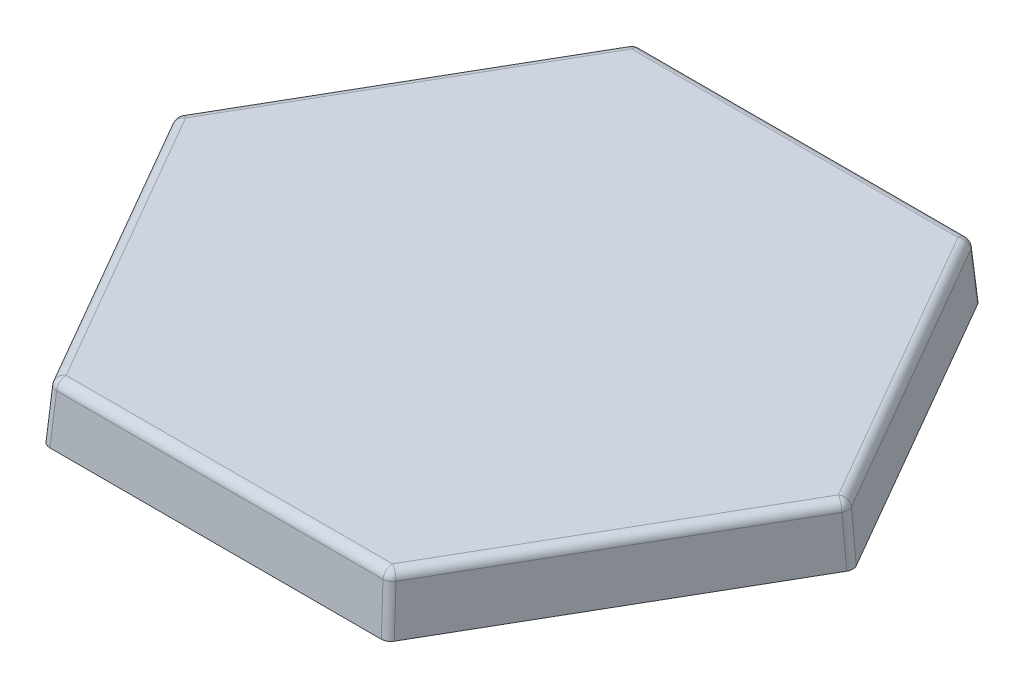
ISO-10303-21;
HEADER;
FILE_DESCRIPTION(('STEP AP214'),'2;1');
FILE_NAME('part.step','',(''),(''),'','','');
FILE_SCHEMA(('AUTOMOTIVE_DESIGN { 1 0 10303 214 1 1 1 1 }'));
ENDSEC;
DATA;
#1=APPLICATION_CONTEXT('core data for automotive mechanical design processes');
#2=APPLICATION_PROTOCOL_DEFINITION('international standard','automotive_design',2000,#1);
#3=PRODUCT_CONTEXT('',#1,'mechanical');
#4=PRODUCT('Part','Part','',(#3));
#5=PRODUCT_RELATED_PRODUCT_CATEGORY('part','',(#4));
#6=PRODUCT_DEFINITION_FORMATION('','',#4);
#7=PRODUCT_DEFINITION_CONTEXT('part definition',#1,'design');
#8=PRODUCT_DEFINITION('design','',#6,#7);
#9=PRODUCT_DEFINITION_SHAPE('','',#8);
#10=(LENGTH_UNIT() NAMED_UNIT(*) SI_UNIT(.MILLI.,.METRE.));
#11=(NAMED_UNIT(*) PLANE_ANGLE_UNIT() SI_UNIT($,.RADIAN.));
#12=(NAMED_UNIT(*) SI_UNIT($,.STERADIAN.) SOLID_ANGLE_UNIT());
#13=UNCERTAINTY_MEASURE_WITH_UNIT(LENGTH_MEASURE(1.E-05),#10,'distance_accuracy_value','');
#14=(GEOMETRIC_REPRESENTATION_CONTEXT(3) GLOBAL_UNCERTAINTY_ASSIGNED_CONTEXT((#13)) GLOBAL_UNIT_ASSIGNED_CONTEXT((#10,
#11,#12)) REPRESENTATION_CONTEXT('',''));
#15=CARTESIAN_POINT('',(0.,0.,0.));
#16=DIRECTION('',(0.,0.,1.));
#17=DIRECTION('',(1.,0.,0.));
#18=AXIS2_PLACEMENT_3D('',#15,#16,#17);
#19=CARTESIAN_POINT('',(35.9038062383901,0.,62.18721659));
#20=DIRECTION('',(0.862729915662821,0.0871557427476584,0.498097349045872));
#21=DIRECTION('',(0.5,0.,-0.866025403784439));
#22=AXIS2_PLACEMENT_3D('',#19,#20,#21);
#23=PLANE('',#22);
#24=DIRECTION('',(0.5,0.,-0.866025403784439));
#25=VECTOR('',#24,1.);
#26=CARTESIAN_POINT('',(35.4359946785055,10.1743114854953,61.2172161517632));
#27=LINE('',#26,#25);
#28=CARTESIAN_POINT('',(70.2046176256569,10.1743114854953,0.996194698091736));
#29=VERTEX_POINT('',#28);
#30=CARTESIAN_POINT('',(35.9650387284913,10.1743114854953,60.3008849777458));
#31=VERTEX_POINT('',#30);
#32=EDGE_CURVE('E365',#29,#31,#27,.F.);
#33=ORIENTED_EDGE('',*,*,#32,.T.);
#34=DIRECTION('',(-0.0502558068751963,0.994935885120892,-0.0870456108832093));
#35=VECTOR('',#34,1.);
#36=CARTESIAN_POINT('',(36.4818647827895,-0.0575168296613353,61.1960539624656));
#37=LINE('',#36,#35);
#38=CARTESIAN_POINT('',(36.4789595154986,0.,61.1910218919082));
#39=VERTEX_POINT('',#38);
#40=EDGE_CURVE('E369',#31,#39,#37,.F.);
#41=ORIENTED_EDGE('',*,*,#40,.T.);
#42=DIRECTION('',(0.5,0.,-0.866025403784439));
#43=VECTOR('',#42,1.);
#44=CARTESIAN_POINT('',(35.9038062383901,0.,62.18721659));
#45=LINE('',#44,#43);
#46=CARTESIAN_POINT('',(71.2324591996716,0.,0.996194698091743));
#47=VERTEX_POINT('',#46);
#48=EDGE_CURVE('E288',#39,#47,#45,.T.);
#49=ORIENTED_EDGE('',*,*,#48,.T.);
#50=DIRECTION('',(-0.100511613750393,0.994935885120892,0.));
#51=VECTOR('',#50,1.);
#52=CARTESIAN_POINT('',(70.8755484979047,3.53295755307842,0.996194698091736));
#53=LINE('',#52,#51);
#54=EDGE_CURVE('E367',#47,#29,#53,.T.);
#55=ORIENTED_EDGE('',*,*,#54,.T.);
#56=EDGE_LOOP('',(#33,#41,#49,#55));
#57=FACE_BOUND('',#56,.T.);
#58=ADVANCED_FACE('F33',(#57),#23,.T.);
#59=CARTESIAN_POINT('',(71.8076124767801,0.,0.));
#60=DIRECTION('',(0.862729915662821,0.0871557427476584,-0.498097349045873));
#61=DIRECTION('',(-0.5,0.,-0.866025403784439));
#62=AXIS2_PLACEMENT_3D('',#59,#60,#61);
#63=PLANE('',#62);
#64=DIRECTION('',(-0.5,0.,-0.866025403784439));
#65=VECTOR('',#64,1.);
#66=CARTESIAN_POINT('',(70.7336616756428,10.1743114854953,-0.0798635240743281));
#67=LINE('',#66,#65);
#68=CARTESIAN_POINT('',(35.9650387284913,10.1743114854953,-60.3008849777458));
#69=VERTEX_POINT('',#68);
#70=CARTESIAN_POINT('',(70.2046176256569,10.1743114854953,-0.996194698091754));
#71=VERTEX_POINT('',#70);
#72=EDGE_CURVE('E371',#69,#71,#67,.F.);
#73=ORIENTED_EDGE('',*,*,#72,.T.);
#74=DIRECTION('',(-0.100511613750393,0.994935885120892,0.));
#75=VECTOR('',#74,1.);
#76=CARTESIAN_POINT('',(71.2382697342533,-0.0575168296613346,-0.996194698091753));
#77=LINE('',#76,#75);
#78=CARTESIAN_POINT('',(71.2324591996716,0.,-0.996194698091751));
#79=VERTEX_POINT('',#78);
#80=EDGE_CURVE('E375',#71,#79,#77,.F.);
#81=ORIENTED_EDGE('',*,*,#80,.T.);
#82=DIRECTION('',(-0.5,0.,-0.866025403784439));
#83=VECTOR('',#82,1.);
#84=CARTESIAN_POINT('',(71.8076124767801,0.,0.));
#85=LINE('',#84,#83);
#86=CARTESIAN_POINT('',(36.4789595154986,0.,-61.1910218919083));
#87=VERTEX_POINT('',#86);
#88=EDGE_CURVE('E323',#79,#87,#85,.T.);
#89=ORIENTED_EDGE('',*,*,#88,.T.);
#90=DIRECTION('',(-0.0502558068751962,0.994935885120892,0.0870456108832093));
#91=VECTOR('',#90,1.);
#92=CARTESIAN_POINT('',(36.3005041646152,3.53295755307842,-60.8819281572956));
#93=LINE('',#92,#91);
#94=EDGE_CURVE('E373',#87,#69,#93,.T.);
#95=ORIENTED_EDGE('',*,*,#94,.T.);
#96=EDGE_LOOP('',(#73,#81,#89,#95));
#97=FACE_BOUND('',#96,.T.);
#98=ADVANCED_FACE('F490',(#97),#63,.T.);
#99=CARTESIAN_POINT('',(35.90380623839,0.,-62.18721659));
#100=DIRECTION('',(0.,0.0871557427476584,-0.996194698091746));
#101=DIRECTION('',(0.,0.996194698091746,0.0871557427476584));
#102=AXIS2_PLACEMENT_3D('',#99,#100,#101);
#103=PLANE('',#102);
#104=DIRECTION('',(-1.,0.,0.));
#105=VECTOR('',#104,1.);
#106=CARTESIAN_POINT('',(35.2976669971372,10.1743114854953,-61.2970796758376));
#107=LINE('',#106,#105);
#108=CARTESIAN_POINT('',(-34.2395788971657,10.1743114854953,-61.2970796758376));
#109=VERTEX_POINT('',#108);
#110=CARTESIAN_POINT('',(34.2395788971656,10.1743114854953,-61.2970796758376));
#111=VERTEX_POINT('',#110);
#112=EDGE_CURVE('E377',#109,#111,#107,.F.);
#113=ORIENTED_EDGE('',*,*,#112,.T.);
#114=DIRECTION('',(-0.0502558068751963,0.994935885120892,0.0870456108832093));
#115=VECTOR('',#114,1.);
#116=CARTESIAN_POINT('',(34.7564049514638,-0.057516829661335,-62.1922486605573));
#117=LINE('',#116,#115);
#118=CARTESIAN_POINT('',(34.753499684173,0.,-62.18721659));
#119=VERTEX_POINT('',#118);
#120=EDGE_CURVE('E381',#111,#119,#117,.F.);
#121=ORIENTED_EDGE('',*,*,#120,.T.);
#122=DIRECTION('',(-1.,0.,0.));
#123=VECTOR('',#122,1.);
#124=CARTESIAN_POINT('',(35.90380623839,0.,-62.18721659));
#125=LINE('',#124,#123);
#126=CARTESIAN_POINT('',(-34.753499684173,0.,-62.18721659));
#127=VERTEX_POINT('',#126);
#128=EDGE_CURVE('E326',#119,#127,#125,.T.);
#129=ORIENTED_EDGE('',*,*,#128,.T.);
#130=DIRECTION('',(0.0502558068751963,0.994935885120892,0.0870456108832093));
#131=VECTOR('',#130,1.);
#132=CARTESIAN_POINT('',(-34.5750443332895,3.53295755307842,-61.8781228553874));
#133=LINE('',#132,#131);
#134=EDGE_CURVE('E379',#127,#109,#133,.T.);
#135=ORIENTED_EDGE('',*,*,#134,.T.);
#136=EDGE_LOOP('',(#113,#121,#129,#135));
#137=FACE_BOUND('',#136,.T.);
#138=ADVANCED_FACE('F460',(#137),#103,.T.);
#139=CARTESIAN_POINT('',(-35.9038062383901,0.,-62.18721659));
#140=DIRECTION('',(-0.862729915662821,0.0871557427476584,-0.498097349045873));
#141=DIRECTION('',(-0.5,0.,0.866025403784439));
#142=AXIS2_PLACEMENT_3D('',#139,#140,#141);
#143=PLANE('',#142);
#144=DIRECTION('',(-0.5,0.,0.866025403784439));
#145=VECTOR('',#144,1.);
#146=CARTESIAN_POINT('',(-35.4359946785055,10.1743114854953,-61.2172161517632));
#147=LINE('',#146,#145);
#148=CARTESIAN_POINT('',(-70.2046176256569,10.1743114854953,-0.996194698091738));
#149=VERTEX_POINT('',#148);
#150=CARTESIAN_POINT('',(-35.9650387284913,10.1743114854953,-60.3008849777458));
#151=VERTEX_POINT('',#150);
#152=EDGE_CURVE('E383',#149,#151,#147,.F.);
#153=ORIENTED_EDGE('',*,*,#152,.T.);
#154=DIRECTION('',(0.0502558068751963,0.994935885120892,0.0870456108832093));
#155=VECTOR('',#154,1.);
#156=CARTESIAN_POINT('',(-36.4818647827895,-0.0575168296613353,-61.1960539624656));
#157=LINE('',#156,#155);
#158=CARTESIAN_POINT('',(-36.4789595154986,0.,-61.1910218919083));
#159=VERTEX_POINT('',#158);
#160=EDGE_CURVE('E387',#151,#159,#157,.F.);
#161=ORIENTED_EDGE('',*,*,#160,.T.);
#162=DIRECTION('',(-0.5,0.,0.866025403784439));
#163=VECTOR('',#162,1.);
#164=CARTESIAN_POINT('',(-35.9038062383901,0.,-62.18721659));
#165=LINE('',#164,#163);
#166=CARTESIAN_POINT('',(-71.2324591996716,0.,-0.996194698091743));
#167=VERTEX_POINT('',#166);
#168=EDGE_CURVE('E329',#159,#167,#165,.T.);
#169=ORIENTED_EDGE('',*,*,#168,.T.);
#170=DIRECTION('',(0.100511613750393,0.994935885120892,0.));
#171=VECTOR('',#170,1.);
#172=CARTESIAN_POINT('',(-70.8755484979047,3.53295755307842,-0.996194698091743));
#173=LINE('',#172,#171);
#174=EDGE_CURVE('E385',#167,#149,#173,.T.);
#175=ORIENTED_EDGE('',*,*,#174,.T.);
#176=EDGE_LOOP('',(#153,#161,#169,#175));
#177=FACE_BOUND('',#176,.T.);
#178=ADVANCED_FACE('F559',(#177),#143,.T.);
#179=CARTESIAN_POINT('',(-71.8076124767801,0.,0.));
#180=DIRECTION('',(-0.862729915662821,0.0871557427476584,0.498097349045873));
#181=DIRECTION('',(0.5,0.,0.866025403784439));
#182=AXIS2_PLACEMENT_3D('',#179,#180,#181);
#183=PLANE('',#182);
#184=DIRECTION('',(0.5,0.,0.866025403784439));
#185=VECTOR('',#184,1.);
#186=CARTESIAN_POINT('',(-71.8076124767801,0.,0.));
#187=LINE('',#186,#185);
#188=CARTESIAN_POINT('',(-71.2324591996716,0.,0.996194698091752));
#189=VERTEX_POINT('',#188);
#190=CARTESIAN_POINT('',(-36.4789595154986,0.,61.1910218919082));
#191=VERTEX_POINT('',#190);
#192=EDGE_CURVE('E332',#189,#191,#187,.T.);
#193=ORIENTED_EDGE('',*,*,#192,.T.);
#194=DIRECTION('',(0.0502558068751963,0.994935885120892,-0.0870456108832093));
#195=VECTOR('',#194,1.);
#196=CARTESIAN_POINT('',(-36.3005041646152,3.53295755307842,60.8819281572956));
#197=LINE('',#196,#195);
#198=CARTESIAN_POINT('',(-35.9650387284913,10.1743114854953,60.3008849777458));
#199=VERTEX_POINT('',#198);
#200=EDGE_CURVE('E363',#191,#199,#197,.T.);
#201=ORIENTED_EDGE('',*,*,#200,.T.);
#202=DIRECTION('',(0.5,0.,0.866025403784439));
#203=VECTOR('',#202,1.);
#204=CARTESIAN_POINT('',(-70.7336616756427,10.1743114854953,0.0798635240743337));
#205=LINE('',#204,#203);
#206=CARTESIAN_POINT('',(-70.2046176256569,10.1743114854953,0.996194698091755));
#207=VERTEX_POINT('',#206);
#208=EDGE_CURVE('E359',#199,#207,#205,.F.);
#209=ORIENTED_EDGE('',*,*,#208,.T.);
#210=DIRECTION('',(0.100511613750393,0.994935885120892,0.));
#211=VECTOR('',#210,1.);
#212=CARTESIAN_POINT('',(-71.2382697342533,-0.0575168296613346,0.996194698091754));
#213=LINE('',#212,#211);
#214=EDGE_CURVE('E361',#207,#189,#213,.F.);
#215=ORIENTED_EDGE('',*,*,#214,.T.);
#216=EDGE_LOOP('',(#193,#201,#209,#215));
#217=FACE_BOUND('',#216,.T.);
#218=ADVANCED_FACE('F522',(#217),#183,.T.);
#219=CARTESIAN_POINT('',(-35.9038062383901,0.,62.18721659));
#220=DIRECTION('',(0.,0.0871557427476584,0.996194698091746));
#221=DIRECTION('',(0.,-0.996194698091746,0.0871557427476584));
#222=AXIS2_PLACEMENT_3D('',#219,#220,#221);
#223=PLANE('',#222);
#224=DIRECTION('',(1.,0.,0.));
#225=VECTOR('',#224,1.);
#226=CARTESIAN_POINT('',(-35.2976669971373,10.1743114854953,61.2970796758376));
#227=LINE('',#226,#225);
#228=CARTESIAN_POINT('',(34.2395788971657,10.1743114854953,61.2970796758376));
#229=VERTEX_POINT('',#228);
#230=CARTESIAN_POINT('',(-34.2395788971657,10.1743114854953,61.2970796758376));
#231=VERTEX_POINT('',#230);
#232=EDGE_CURVE('E340',#229,#231,#227,.F.);
#233=ORIENTED_EDGE('',*,*,#232,.T.);
#234=DIRECTION('',(0.0502558068751963,0.994935885120892,-0.0870456108832093));
#235=VECTOR('',#234,1.);
#236=CARTESIAN_POINT('',(-34.7564049514638,-0.057516829661335,62.1922486605573));
#237=LINE('',#236,#235);
#238=CARTESIAN_POINT('',(-34.753499684173,0.,62.18721659));
#239=VERTEX_POINT('',#238);
#240=EDGE_CURVE('E344',#231,#239,#237,.F.);
#241=ORIENTED_EDGE('',*,*,#240,.T.);
#242=DIRECTION('',(1.,0.,0.));
#243=VECTOR('',#242,1.);
#244=CARTESIAN_POINT('',(-35.9038062383901,0.,62.18721659));
#245=LINE('',#244,#243);
#246=CARTESIAN_POINT('',(34.753499684173,0.,62.18721659));
#247=VERTEX_POINT('',#246);
#248=EDGE_CURVE('E335',#239,#247,#245,.T.);
#249=ORIENTED_EDGE('',*,*,#248,.T.);
#250=DIRECTION('',(-0.0502558068751963,0.994935885120892,-0.0870456108832093));
#251=VECTOR('',#250,1.);
#252=CARTESIAN_POINT('',(34.5750443332895,3.53295755307842,61.8781228553873));
#253=LINE('',#252,#251);
#254=EDGE_CURVE('E342',#247,#229,#253,.T.);
#255=ORIENTED_EDGE('',*,*,#254,.T.);
#256=EDGE_LOOP('',(#233,#241,#249,#255));
#257=FACE_BOUND('',#256,.T.);
#258=ADVANCED_FACE('F515',(#257),#223,.T.);
#259=CARTESIAN_POINT('',(0.,12.,0.));
#260=DIRECTION('',(0.,1.,0.));
#261=DIRECTION('',(0.,0.,1.));
#262=AXIS2_PLACEMENT_3D('',#259,#260,#261);
#263=PLANE('',#262);
#264=DIRECTION('',(-0.5,0.,-0.866025403784439));
#265=VECTOR('',#264,1.);
#266=CARTESIAN_POINT('',(-33.7105348471798,12.,60.2210214536715));
#267=LINE('',#266,#265);
#268=CARTESIAN_POINT('',(-68.4791577943313,12.,0.));
#269=VERTEX_POINT('',#268);
#270=CARTESIAN_POINT('',(-34.2395788971656,12.,59.3046902796541));
#271=VERTEX_POINT('',#270);
#272=EDGE_CURVE('E389',#269,#271,#267,.F.);
#273=ORIENTED_EDGE('',*,*,#272,.T.);
#274=DIRECTION('',(-1.,0.,0.));
#275=VECTOR('',#274,1.);
#276=CARTESIAN_POINT('',(35.2976669971373,12.,59.3046902796541));
#277=LINE('',#276,#275);
#278=CARTESIAN_POINT('',(34.2395788971657,12.,59.3046902796541));
#279=VERTEX_POINT('',#278);
#280=EDGE_CURVE('E11',#271,#279,#277,.F.);
#281=ORIENTED_EDGE('',*,*,#280,.T.);
#282=DIRECTION('',(-0.5,0.,0.866025403784439));
#283=VECTOR('',#282,1.);
#284=CARTESIAN_POINT('',(69.0082018443171,12.,-0.916331174017432));
#285=LINE('',#284,#283);
#286=CARTESIAN_POINT('',(68.4791577943313,12.,0.));
#287=VERTEX_POINT('',#286);
#288=EDGE_CURVE('E42',#279,#287,#285,.F.);
#289=ORIENTED_EDGE('',*,*,#288,.T.);
#290=DIRECTION('',(0.5,0.,0.866025403784439));
#291=VECTOR('',#290,1.);
#292=CARTESIAN_POINT('',(33.7105348471798,12.,-60.2210214536715));
#293=LINE('',#292,#291);
#294=CARTESIAN_POINT('',(34.2395788971656,12.,-59.3046902796541));
#295=VERTEX_POINT('',#294);
#296=EDGE_CURVE('E395',#287,#295,#293,.F.);
#297=ORIENTED_EDGE('',*,*,#296,.T.);
#298=DIRECTION('',(1.,0.,0.));
#299=VECTOR('',#298,1.);
#300=CARTESIAN_POINT('',(-35.2976669971373,12.,-59.3046902796541));
#301=LINE('',#300,#299);
#302=CARTESIAN_POINT('',(-34.2395788971656,12.,-59.3046902796541));
#303=VERTEX_POINT('',#302);
#304=EDGE_CURVE('E393',#295,#303,#301,.F.);
#305=ORIENTED_EDGE('',*,*,#304,.T.);
#306=DIRECTION('',(0.5,0.,-0.866025403784439));
#307=VECTOR('',#306,1.);
#308=CARTESIAN_POINT('',(-69.0082018443171,12.,0.916331174017439));
#309=LINE('',#308,#307);
#310=EDGE_CURVE('E391',#303,#269,#309,.F.);
#311=ORIENTED_EDGE('',*,*,#310,.T.);
#312=EDGE_LOOP('',(#273,#281,#289,#297,#305,#311));
#313=FACE_BOUND('',#312,.T.);
#314=ADVANCED_FACE('F483',(#313),#263,.T.);
#315=CARTESIAN_POINT('',(0.,0.,0.));
#316=DIRECTION('',(0.,1.,0.));
#317=DIRECTION('',(0.,0.,1.));
#318=AXIS2_PLACEMENT_3D('',#315,#316,#317);
#319=PLANE('',#318);
#320=DIRECTION('',(-0.5,0.,0.866025403784439));
#321=VECTOR('',#320,1.);
#322=CARTESIAN_POINT('',(70.4367328411343,0.,0.));
#323=LINE('',#322,#321);
#324=CARTESIAN_POINT('',(70.4367328411343,0.,0.));
#325=VERTEX_POINT('',#324);
#326=CARTESIAN_POINT('',(35.2183664205672,0.,61.));
#327=VERTEX_POINT('',#326);
#328=EDGE_CURVE('E255',#325,#327,#323,.T.);
#329=ORIENTED_EDGE('',*,*,#328,.F.);
#330=DIRECTION('',(0.5,0.,0.866025403784439));
#331=VECTOR('',#330,1.);
#332=CARTESIAN_POINT('',(35.2183664205672,0.,-61.));
#333=LINE('',#332,#331);
#334=CARTESIAN_POINT('',(35.2183664205672,0.,-61.));
#335=VERTEX_POINT('',#334);
#336=EDGE_CURVE('E222',#335,#325,#333,.T.);
#337=ORIENTED_EDGE('',*,*,#336,.F.);
#338=DIRECTION('',(1.,0.,0.));
#339=VECTOR('',#338,1.);
#340=CARTESIAN_POINT('',(-35.2183664205672,0.,-61.));
#341=LINE('',#340,#339);
#342=CARTESIAN_POINT('',(-35.2183664205672,0.,-61.));
#343=VERTEX_POINT('',#342);
#344=EDGE_CURVE('E241',#343,#335,#341,.T.);
#345=ORIENTED_EDGE('',*,*,#344,.F.);
#346=DIRECTION('',(0.5,0.,-0.866025403784439));
#347=VECTOR('',#346,1.);
#348=CARTESIAN_POINT('',(-70.4367328411343,0.,0.));
#349=LINE('',#348,#347);
#350=CARTESIAN_POINT('',(-70.4367328411343,0.,0.));
#351=VERTEX_POINT('',#350);
#352=EDGE_CURVE('E244',#351,#343,#349,.T.);
#353=ORIENTED_EDGE('',*,*,#352,.F.);
#354=DIRECTION('',(-0.5,0.,-0.866025403784439));
#355=VECTOR('',#354,1.);
#356=CARTESIAN_POINT('',(-35.2183664205672,0.,61.));
#357=LINE('',#356,#355);
#358=CARTESIAN_POINT('',(-35.2183664205672,0.,61.));
#359=VERTEX_POINT('',#358);
#360=EDGE_CURVE('E260',#359,#351,#357,.T.);
#361=ORIENTED_EDGE('',*,*,#360,.F.);
#362=DIRECTION('',(-1.,0.,0.));
#363=VECTOR('',#362,1.);
#364=CARTESIAN_POINT('',(35.2183664205672,0.,61.));
#365=LINE('',#364,#363);
#366=EDGE_CURVE('E257',#327,#359,#365,.T.);
#367=ORIENTED_EDGE('',*,*,#366,.F.);
#368=EDGE_LOOP('',(#329,#337,#345,#353,#361,#367));
#369=FACE_BOUND('',#368,.T.);
#370=ORIENTED_EDGE('',*,*,#248,.F.);
#371=CARTESIAN_POINT('',(-34.744694931543,0.,60.1795769149133));
#372=DIRECTION('',(0.,1.,0.));
#373=DIRECTION('',(-0.5,0.,0.866025403784439));
#374=AXIS2_PLACEMENT_3D('',#371,#372,#373);
#375=ELLIPSE('',#374,2.01017978134037,2.);
#376=EDGE_CURVE('E357',#239,#191,#375,.F.);
#377=ORIENTED_EDGE('',*,*,#376,.T.);
#378=ORIENTED_EDGE('',*,*,#192,.F.);
#379=CARTESIAN_POINT('',(-69.4893898630859,0.,0.));
#380=DIRECTION('',(0.,1.,0.));
#381=DIRECTION('',(-1.,0.,0.));
#382=AXIS2_PLACEMENT_3D('',#379,#380,#381);
#383=ELLIPSE('',#382,2.01017978134037,2.);
#384=EDGE_CURVE('E347',#189,#167,#383,.F.);
#385=ORIENTED_EDGE('',*,*,#384,.T.);
#386=ORIENTED_EDGE('',*,*,#168,.F.);
#387=CARTESIAN_POINT('',(-34.744694931543,0.,-60.1795769149133));
#388=DIRECTION('',(0.,1.,0.));
#389=DIRECTION('',(-0.5,0.,-0.866025403784439));
#390=AXIS2_PLACEMENT_3D('',#387,#388,#389);
#391=ELLIPSE('',#390,2.01017978134037,2.);
#392=EDGE_CURVE('E349',#159,#127,#391,.F.);
#393=ORIENTED_EDGE('',*,*,#392,.T.);
#394=ORIENTED_EDGE('',*,*,#128,.F.);
#395=CARTESIAN_POINT('',(34.744694931543,0.,-60.1795769149133));
#396=DIRECTION('',(0.,1.,0.));
#397=DIRECTION('',(0.5,0.,-0.866025403784439));
#398=AXIS2_PLACEMENT_3D('',#395,#396,#397);
#399=ELLIPSE('',#398,2.01017978134037,2.);
#400=EDGE_CURVE('E351',#119,#87,#399,.F.);
#401=ORIENTED_EDGE('',*,*,#400,.T.);
#402=ORIENTED_EDGE('',*,*,#88,.F.);
#403=CARTESIAN_POINT('',(69.4893898630859,0.,0.));
#404=DIRECTION('',(0.,1.,0.));
#405=DIRECTION('',(1.,0.,0.));
#406=AXIS2_PLACEMENT_3D('',#403,#404,#405);
#407=ELLIPSE('',#406,2.01017978134037,2.);
#408=EDGE_CURVE('E353',#79,#47,#407,.F.);
#409=ORIENTED_EDGE('',*,*,#408,.T.);
#410=ORIENTED_EDGE('',*,*,#48,.F.);
#411=CARTESIAN_POINT('',(34.744694931543,0.,60.1795769149133));
#412=DIRECTION('',(0.,1.,0.));
#413=DIRECTION('',(0.5,0.,0.866025403784439));
#414=AXIS2_PLACEMENT_3D('',#411,#412,#413);
#415=ELLIPSE('',#414,2.01017978134037,2.);
#416=EDGE_CURVE('E355',#39,#247,#415,.F.);
#417=ORIENTED_EDGE('',*,*,#416,.T.);
#418=EDGE_LOOP('',(#370,#377,#378,#385,#386,#393,#394,#401,#402,#409,#410,#417));
#419=FACE_BOUND('',#418,.T.);
#420=ADVANCED_FACE('F464',(#369,#419),#319,.F.);
#421=CARTESIAN_POINT('',(0.,1.,0.));
#422=DIRECTION('',(0.,-1.,0.));
#423=DIRECTION('',(0.,0.,-1.));
#424=AXIS2_PLACEMENT_3D('',#421,#422,#423);
#425=PLANE('',#424);
#426=DIRECTION('',(0.5,0.,0.866025403784439));
#427=VECTOR('',#426,1.);
#428=CARTESIAN_POINT('',(35.2183664205672,1.,-61.));
#429=LINE('',#428,#427);
#430=CARTESIAN_POINT('',(35.2183664205672,1.,-61.));
#431=VERTEX_POINT('',#430);
#432=CARTESIAN_POINT('',(70.4367328411343,1.,0.));
#433=VERTEX_POINT('',#432);
#434=EDGE_CURVE('E219',#431,#433,#429,.T.);
#435=ORIENTED_EDGE('',*,*,#434,.T.);
#436=DIRECTION('',(-0.5,0.,0.866025403784439));
#437=VECTOR('',#436,1.);
#438=CARTESIAN_POINT('',(70.4367328411343,1.,0.));
#439=LINE('',#438,#437);
#440=CARTESIAN_POINT('',(35.2183664205672,1.,61.));
#441=VERTEX_POINT('',#440);
#442=EDGE_CURVE('E230',#433,#441,#439,.T.);
#443=ORIENTED_EDGE('',*,*,#442,.T.);
#444=DIRECTION('',(-1.,0.,0.));
#445=VECTOR('',#444,1.);
#446=CARTESIAN_POINT('',(35.2183664205672,1.,61.));
#447=LINE('',#446,#445);
#448=CARTESIAN_POINT('',(-35.2183664205672,1.,61.));
#449=VERTEX_POINT('',#448);
#450=EDGE_CURVE('E235',#441,#449,#447,.T.);
#451=ORIENTED_EDGE('',*,*,#450,.T.);
#452=DIRECTION('',(-0.5,0.,-0.866025403784439));
#453=VECTOR('',#452,1.);
#454=CARTESIAN_POINT('',(-35.2183664205672,1.,61.));
#455=LINE('',#454,#453);
#456=CARTESIAN_POINT('',(-70.4367328411343,1.,0.));
#457=VERTEX_POINT('',#456);
#458=EDGE_CURVE('E248',#449,#457,#455,.T.);
#459=ORIENTED_EDGE('',*,*,#458,.T.);
#460=DIRECTION('',(0.5,0.,-0.866025403784439));
#461=VECTOR('',#460,1.);
#462=CARTESIAN_POINT('',(-70.4367328411343,1.,0.));
#463=LINE('',#462,#461);
#464=CARTESIAN_POINT('',(-35.2183664205672,1.,-61.));
#465=VERTEX_POINT('',#464);
#466=EDGE_CURVE('E251',#457,#465,#463,.T.);
#467=ORIENTED_EDGE('',*,*,#466,.T.);
#468=DIRECTION('',(1.,0.,0.));
#469=VECTOR('',#468,1.);
#470=CARTESIAN_POINT('',(-35.2183664205672,1.,-61.));
#471=LINE('',#470,#469);
#472=EDGE_CURVE('E227',#465,#431,#471,.T.);
#473=ORIENTED_EDGE('',*,*,#472,.T.);
#474=EDGE_LOOP('',(#435,#443,#451,#459,#467,#473));
#475=FACE_BOUND('',#474,.T.);
#476=DIRECTION('',(-0.5,0.,-0.866025403784439));
#477=VECTOR('',#476,1.);
#478=CARTESIAN_POINT('',(34.2765736116261,1.,-59.4562556682371));
#479=LINE('',#478,#477);
#480=CARTESIAN_POINT('',(68.60365882669,1.,0.));
#481=VERTEX_POINT('',#480);
#482=CARTESIAN_POINT('',(34.301829413345,1.,-59.4125113364741));
#483=VERTEX_POINT('',#482);
#484=EDGE_CURVE('E282',#481,#483,#479,.T.);
#485=ORIENTED_EDGE('',*,*,#484,.T.);
#486=DIRECTION('',(-1.,0.,0.));
#487=VECTOR('',#486,1.);
#488=CARTESIAN_POINT('',(-34.3523410167827,1.,-59.4125113364741));
#489=LINE('',#488,#487);
#490=CARTESIAN_POINT('',(-34.301829413345,1.,-59.4125113364741));
#491=VERTEX_POINT('',#490);
#492=EDGE_CURVE('E280',#483,#491,#489,.T.);
#493=ORIENTED_EDGE('',*,*,#492,.T.);
#494=DIRECTION('',(-0.5,0.,0.866025403784438));
#495=VECTOR('',#494,1.);
#496=CARTESIAN_POINT('',(-68.6289146284089,1.,0.043744331762962));
#497=LINE('',#496,#495);
#498=CARTESIAN_POINT('',(-68.60365882669,1.,0.));
#499=VERTEX_POINT('',#498);
#500=EDGE_CURVE('E278',#491,#499,#497,.T.);
#501=ORIENTED_EDGE('',*,*,#500,.T.);
#502=DIRECTION('',(0.5,0.,0.866025403784439));
#503=VECTOR('',#502,1.);
#504=CARTESIAN_POINT('',(-34.2765736116261,1.,59.4562556682371));
#505=LINE('',#504,#503);
#506=CARTESIAN_POINT('',(-34.301829413345,1.,59.4125113364741));
#507=VERTEX_POINT('',#506);
#508=EDGE_CURVE('E276',#499,#507,#505,.T.);
#509=ORIENTED_EDGE('',*,*,#508,.T.);
#510=DIRECTION('',(1.,0.,0.));
#511=VECTOR('',#510,1.);
#512=CARTESIAN_POINT('',(34.3523410167827,1.,59.4125113364741));
#513=LINE('',#512,#511);
#514=CARTESIAN_POINT('',(34.3018294133449,0.999999999999999,59.4125113364741));
#515=VERTEX_POINT('',#514);
#516=EDGE_CURVE('E267',#507,#515,#513,.T.);
#517=ORIENTED_EDGE('',*,*,#516,.T.);
#518=DIRECTION('',(0.5,0.,-0.866025403784439));
#519=VECTOR('',#518,1.);
#520=CARTESIAN_POINT('',(68.6289146284089,1.,-0.043744331762948));
#521=LINE('',#520,#519);
#522=EDGE_CURVE('E338',#515,#481,#521,.T.);
#523=ORIENTED_EDGE('',*,*,#522,.T.);
#524=EDGE_LOOP('',(#485,#493,#501,#509,#517,#523));
#525=FACE_BOUND('',#524,.T.);
#526=ADVANCED_FACE('F237',(#475,#525),#425,.T.);
#527=CARTESIAN_POINT('',(35.2183664205672,1.,-61.));
#528=DIRECTION('',(0.866025403784439,0.,-0.5));
#529=DIRECTION('',(-0.5,0.,-0.866025403784439));
#530=AXIS2_PLACEMENT_3D('',#527,#528,#529);
#531=PLANE('',#530);
#532=ORIENTED_EDGE('',*,*,#336,.T.);
#533=DIRECTION('',(0.,-1.,0.));
#534=VECTOR('',#533,1.);
#535=CARTESIAN_POINT('',(70.4367328411343,1.,0.));
#536=LINE('',#535,#534);
#537=EDGE_CURVE('E215',#433,#325,#536,.T.);
#538=ORIENTED_EDGE('',*,*,#537,.F.);
#539=ORIENTED_EDGE('',*,*,#434,.F.);
#540=DIRECTION('',(0.,-1.,0.));
#541=VECTOR('',#540,1.);
#542=CARTESIAN_POINT('',(35.2183664205672,1.,-61.));
#543=LINE('',#542,#541);
#544=EDGE_CURVE('E265',#431,#335,#543,.T.);
#545=ORIENTED_EDGE('',*,*,#544,.T.);
#546=EDGE_LOOP('',(#532,#538,#539,#545));
#547=FACE_BOUND('',#546,.T.);
#548=ADVANCED_FACE('F217',(#547),#531,.F.);
#549=CARTESIAN_POINT('',(-35.2183664205672,1.,-61.));
#550=DIRECTION('',(0.,0.,-1.));
#551=DIRECTION('',(-1.,0.,0.));
#552=AXIS2_PLACEMENT_3D('',#549,#550,#551);
#553=PLANE('',#552);
#554=ORIENTED_EDGE('',*,*,#344,.T.);
#555=ORIENTED_EDGE('',*,*,#544,.F.);
#556=ORIENTED_EDGE('',*,*,#472,.F.);
#557=DIRECTION('',(0.,-1.,0.));
#558=VECTOR('',#557,1.);
#559=CARTESIAN_POINT('',(-35.2183664205672,1.,-61.));
#560=LINE('',#559,#558);
#561=EDGE_CURVE('E268',#465,#343,#560,.T.);
#562=ORIENTED_EDGE('',*,*,#561,.T.);
#563=EDGE_LOOP('',(#554,#555,#556,#562));
#564=FACE_BOUND('',#563,.T.);
#565=ADVANCED_FACE('F724',(#564),#553,.F.);
#566=CARTESIAN_POINT('',(-70.4367328411343,1.,0.));
#567=DIRECTION('',(-0.866025403784439,0.,-0.5));
#568=DIRECTION('',(-0.5,0.,0.866025403784439));
#569=AXIS2_PLACEMENT_3D('',#566,#567,#568);
#570=PLANE('',#569);
#571=ORIENTED_EDGE('',*,*,#352,.T.);
#572=ORIENTED_EDGE('',*,*,#561,.F.);
#573=ORIENTED_EDGE('',*,*,#466,.F.);
#574=DIRECTION('',(0.,-1.,0.));
#575=VECTOR('',#574,1.);
#576=CARTESIAN_POINT('',(-70.4367328411343,1.,0.));
#577=LINE('',#576,#575);
#578=EDGE_CURVE('E270',#457,#351,#577,.T.);
#579=ORIENTED_EDGE('',*,*,#578,.T.);
#580=EDGE_LOOP('',(#571,#572,#573,#579));
#581=FACE_BOUND('',#580,.T.);
#582=ADVANCED_FACE('F715',(#581),#570,.F.);
#583=CARTESIAN_POINT('',(-35.2183664205672,1.,61.));
#584=DIRECTION('',(-0.866025403784439,0.,0.5));
#585=DIRECTION('',(0.5,0.,0.866025403784439));
#586=AXIS2_PLACEMENT_3D('',#583,#584,#585);
#587=PLANE('',#586);
#588=ORIENTED_EDGE('',*,*,#360,.T.);
#589=ORIENTED_EDGE('',*,*,#578,.F.);
#590=ORIENTED_EDGE('',*,*,#458,.F.);
#591=DIRECTION('',(0.,-1.,0.));
#592=VECTOR('',#591,1.);
#593=CARTESIAN_POINT('',(-35.2183664205672,1.,61.));
#594=LINE('',#593,#592);
#595=EDGE_CURVE('E272',#449,#359,#594,.T.);
#596=ORIENTED_EDGE('',*,*,#595,.T.);
#597=EDGE_LOOP('',(#588,#589,#590,#596));
#598=FACE_BOUND('',#597,.T.);
#599=ADVANCED_FACE('F706',(#598),#587,.F.);
#600=CARTESIAN_POINT('',(35.2183664205672,1.,61.));
#601=DIRECTION('',(0.,0.,1.));
#602=DIRECTION('',(1.,0.,0.));
#603=AXIS2_PLACEMENT_3D('',#600,#601,#602);
#604=PLANE('',#603);
#605=ORIENTED_EDGE('',*,*,#366,.T.);
#606=ORIENTED_EDGE('',*,*,#595,.F.);
#607=ORIENTED_EDGE('',*,*,#450,.F.);
#608=DIRECTION('',(0.,-1.,0.));
#609=VECTOR('',#608,1.);
#610=CARTESIAN_POINT('',(35.2183664205672,1.,61.));
#611=LINE('',#610,#609);
#612=EDGE_CURVE('E226',#441,#327,#611,.T.);
#613=ORIENTED_EDGE('',*,*,#612,.T.);
#614=EDGE_LOOP('',(#605,#606,#607,#613));
#615=FACE_BOUND('',#614,.T.);
#616=ADVANCED_FACE('F697',(#615),#604,.F.);
#617=CARTESIAN_POINT('',(70.4367328411343,1.,0.));
#618=DIRECTION('',(0.866025403784439,0.,0.5));
#619=DIRECTION('',(0.5,0.,-0.866025403784439));
#620=AXIS2_PLACEMENT_3D('',#617,#618,#619);
#621=PLANE('',#620);
#622=ORIENTED_EDGE('',*,*,#328,.T.);
#623=ORIENTED_EDGE('',*,*,#612,.F.);
#624=ORIENTED_EDGE('',*,*,#442,.F.);
#625=ORIENTED_EDGE('',*,*,#537,.T.);
#626=EDGE_LOOP('',(#622,#623,#624,#625));
#627=FACE_BOUND('',#626,.T.);
#628=ADVANCED_FACE('F231',(#627),#621,.F.);
#629=CARTESIAN_POINT('',(0.,10.,0.));
#630=DIRECTION('',(0.,-1.,0.));
#631=DIRECTION('',(0.,0.,-1.));
#632=AXIS2_PLACEMENT_3D('',#629,#630,#631);
#633=PLANE('',#632);
#634=DIRECTION('',(0.5,0.,0.866025403784439));
#635=VECTOR('',#634,1.);
#636=CARTESIAN_POINT('',(50.7708374736081,10.,-29.3125566823704));
#637=LINE('',#636,#635);
#638=CARTESIAN_POINT('',(33.8472249824054,10.,-58.6251133647408));
#639=VERTEX_POINT('',#638);
#640=CARTESIAN_POINT('',(67.6944499648108,10.,0.));
#641=VERTEX_POINT('',#640);
#642=EDGE_CURVE('E284',#639,#641,#637,.T.);
#643=ORIENTED_EDGE('',*,*,#642,.T.);
#644=DIRECTION('',(-0.5,0.,0.866025403784439));
#645=VECTOR('',#644,1.);
#646=CARTESIAN_POINT('',(50.7708374736081,10.,29.3125566823704));
#647=LINE('',#646,#645);
#648=CARTESIAN_POINT('',(33.8472249824054,10.,58.6251133647408));
#649=VERTEX_POINT('',#648);
#650=EDGE_CURVE('E307',#641,#649,#647,.T.);
#651=ORIENTED_EDGE('',*,*,#650,.T.);
#652=DIRECTION('',(-1.,0.,0.));
#653=VECTOR('',#652,1.);
#654=CARTESIAN_POINT('',(0.,10.,58.6251133647408));
#655=LINE('',#654,#653);
#656=CARTESIAN_POINT('',(-33.8472249824054,10.,58.6251133647408));
#657=VERTEX_POINT('',#656);
#658=EDGE_CURVE('E316',#649,#657,#655,.T.);
#659=ORIENTED_EDGE('',*,*,#658,.T.);
#660=DIRECTION('',(-0.5,0.,-0.866025403784439));
#661=VECTOR('',#660,1.);
#662=CARTESIAN_POINT('',(-50.7708374736081,10.,29.3125566823704));
#663=LINE('',#662,#661);
#664=CARTESIAN_POINT('',(-67.6944499648108,10.,0.));
#665=VERTEX_POINT('',#664);
#666=EDGE_CURVE('E313',#657,#665,#663,.T.);
#667=ORIENTED_EDGE('',*,*,#666,.T.);
#668=DIRECTION('',(0.5,0.,-0.866025403784438));
#669=VECTOR('',#668,1.);
#670=CARTESIAN_POINT('',(-50.7708374736081,10.,-29.3125566823704));
#671=LINE('',#670,#669);
#672=CARTESIAN_POINT('',(-33.8472249824054,10.,-58.6251133647408));
#673=VERTEX_POINT('',#672);
#674=EDGE_CURVE('E310',#665,#673,#671,.T.);
#675=ORIENTED_EDGE('',*,*,#674,.T.);
#676=DIRECTION('',(1.,0.,0.));
#677=VECTOR('',#676,1.);
#678=CARTESIAN_POINT('',(0.,10.,-58.6251133647408));
#679=LINE('',#678,#677);
#680=EDGE_CURVE('E294',#673,#639,#679,.T.);
#681=ORIENTED_EDGE('',*,*,#680,.T.);
#682=EDGE_LOOP('',(#643,#651,#659,#667,#675,#681));
#683=FACE_BOUND('',#682,.T.);
#684=ADVANCED_FACE('F696',(#683),#633,.T.);
#685=CARTESIAN_POINT('',(68.7046820335655,0.,0.));
#686=DIRECTION('',(0.862729915662821,0.0871557427476584,0.498097349045873));
#687=DIRECTION('',(0.5,0.,-0.866025403784439));
#688=AXIS2_PLACEMENT_3D('',#685,#686,#687);
#689=PLANE('',#688);
#690=ORIENTED_EDGE('',*,*,#522,.F.);
#691=DIRECTION('',(0.0502558068751963,-0.994935885120892,0.0870456108832093));
#692=VECTOR('',#691,1.);
#693=CARTESIAN_POINT('',(34.1788173028574,3.43532380909566,59.1994481111635));
#694=LINE('',#693,#692);
#695=EDGE_CURVE('E293',#649,#515,#694,.T.);
#696=ORIENTED_EDGE('',*,*,#695,.F.);
#697=ORIENTED_EDGE('',*,*,#650,.F.);
#698=DIRECTION('',(0.100511613750393,-0.994935885120891,0.));
#699=VECTOR('',#698,1.);
#700=CARTESIAN_POINT('',(68.357634605715,3.43532380909566,0.));
#701=LINE('',#700,#699);
#702=EDGE_CURVE('E290',#641,#481,#701,.T.);
#703=ORIENTED_EDGE('',*,*,#702,.T.);
#704=EDGE_LOOP('',(#690,#696,#697,#703));
#705=FACE_BOUND('',#704,.T.);
#706=ADVANCED_FACE('F791',(#705),#689,.F.);
#707=CARTESIAN_POINT('',(34.3523410167827,0.,59.5));
#708=DIRECTION('',(0.,0.0871557427476584,0.996194698091746));
#709=DIRECTION('',(0.,-0.996194698091746,0.0871557427476584));
#710=AXIS2_PLACEMENT_3D('',#707,#708,#709);
#711=PLANE('',#710);
#712=ORIENTED_EDGE('',*,*,#516,.F.);
#713=DIRECTION('',(-0.0502558068751963,-0.994935885120892,0.0870456108832093));
#714=VECTOR('',#713,1.);
#715=CARTESIAN_POINT('',(-34.1788173028575,3.43532380909566,59.1994481111635));
#716=LINE('',#715,#714);
#717=EDGE_CURVE('E297',#657,#507,#716,.T.);
#718=ORIENTED_EDGE('',*,*,#717,.F.);
#719=ORIENTED_EDGE('',*,*,#658,.F.);
#720=ORIENTED_EDGE('',*,*,#695,.T.);
#721=EDGE_LOOP('',(#712,#718,#719,#720));
#722=FACE_BOUND('',#721,.T.);
#723=ADVANCED_FACE('F782',(#722),#711,.F.);
#724=CARTESIAN_POINT('',(-34.3523410167828,0.,59.5));
#725=DIRECTION('',(-0.862729915662821,0.0871557427476584,0.498097349045873));
#726=DIRECTION('',(0.5,0.,0.866025403784439));
#727=AXIS2_PLACEMENT_3D('',#724,#725,#726);
#728=PLANE('',#727);
#729=ORIENTED_EDGE('',*,*,#508,.F.);
#730=DIRECTION('',(-0.100511613750393,-0.994935885120891,0.));
#731=VECTOR('',#730,1.);
#732=CARTESIAN_POINT('',(-68.357634605715,3.43532380909566,0.));
#733=LINE('',#732,#731);
#734=EDGE_CURVE('E300',#665,#499,#733,.T.);
#735=ORIENTED_EDGE('',*,*,#734,.F.);
#736=ORIENTED_EDGE('',*,*,#666,.F.);
#737=ORIENTED_EDGE('',*,*,#717,.T.);
#738=EDGE_LOOP('',(#729,#735,#736,#737));
#739=FACE_BOUND('',#738,.T.);
#740=ADVANCED_FACE('F773',(#739),#728,.F.);
#741=CARTESIAN_POINT('',(-68.7046820335655,0.,0.));
#742=DIRECTION('',(-0.862729915662821,0.0871557427476584,-0.498097349045873));
#743=DIRECTION('',(-0.5,0.,0.866025403784438));
#744=AXIS2_PLACEMENT_3D('',#741,#742,#743);
#745=PLANE('',#744);
#746=ORIENTED_EDGE('',*,*,#500,.F.);
#747=DIRECTION('',(-0.0502558068751963,-0.994935885120891,-0.0870456108832093));
#748=VECTOR('',#747,1.);
#749=CARTESIAN_POINT('',(-34.1788173028575,3.43532380909566,-59.1994481111634));
#750=LINE('',#749,#748);
#751=EDGE_CURVE('E289',#673,#491,#750,.T.);
#752=ORIENTED_EDGE('',*,*,#751,.F.);
#753=ORIENTED_EDGE('',*,*,#674,.F.);
#754=ORIENTED_EDGE('',*,*,#734,.T.);
#755=EDGE_LOOP('',(#746,#752,#753,#754));
#756=FACE_BOUND('',#755,.T.);
#757=ADVANCED_FACE('F764',(#756),#745,.F.);
#758=CARTESIAN_POINT('',(-34.3523410167827,0.,-59.5));
#759=DIRECTION('',(0.,0.0871557427476584,-0.996194698091746));
#760=DIRECTION('',(0.,0.996194698091746,0.0871557427476584));
#761=AXIS2_PLACEMENT_3D('',#758,#759,#760);
#762=PLANE('',#761);
#763=ORIENTED_EDGE('',*,*,#492,.F.);
#764=DIRECTION('',(0.0502558068751963,-0.994935885120891,-0.0870456108832093));
#765=VECTOR('',#764,1.);
#766=CARTESIAN_POINT('',(34.1788173028575,3.43532380909566,-59.1994481111635));
#767=LINE('',#766,#765);
#768=EDGE_CURVE('E285',#639,#483,#767,.T.);
#769=ORIENTED_EDGE('',*,*,#768,.F.);
#770=ORIENTED_EDGE('',*,*,#680,.F.);
#771=ORIENTED_EDGE('',*,*,#751,.T.);
#772=EDGE_LOOP('',(#763,#769,#770,#771));
#773=FACE_BOUND('',#772,.T.);
#774=ADVANCED_FACE('F755',(#773),#762,.F.);
#775=CARTESIAN_POINT('',(34.3523410167827,0.,-59.5));
#776=DIRECTION('',(0.862729915662821,0.0871557427476584,-0.498097349045872));
#777=DIRECTION('',(-0.5,0.,-0.866025403784439));
#778=AXIS2_PLACEMENT_3D('',#775,#776,#777);
#779=PLANE('',#778);
#780=ORIENTED_EDGE('',*,*,#484,.F.);
#781=ORIENTED_EDGE('',*,*,#702,.F.);
#782=ORIENTED_EDGE('',*,*,#642,.F.);
#783=ORIENTED_EDGE('',*,*,#768,.T.);
#784=EDGE_LOOP('',(#780,#781,#782,#783));
#785=FACE_BOUND('',#784,.T.);
#786=ADVANCED_FACE('F688',(#785),#779,.F.);
#787=CARTESIAN_POINT('',(34.7564049514638,-0.231828315156652,-60.1998592643738));
#788=DIRECTION('',(0.0502558068751963,-0.994935885120892,-0.0870456108832093));
#789=DIRECTION('',(0.,0.0871557427476584,-0.996194698091745));
#790=AXIS2_PLACEMENT_3D('',#787,#788,#789);
#791=CYLINDRICAL_SURFACE('',#790,2.);
#792=CARTESIAN_POINT('',(34.2395788971656,10.,-59.3046902796541));
#793=DIRECTION('',(-0.0502558068751965,0.994935885120891,0.08704561088321));
#794=DIRECTION('',(0.,-0.0871557427476591,0.996194698091745));
#795=AXIS2_PLACEMENT_3D('',#792,#793,#794);
#796=CIRCLE('',#795,2.);
#797=EDGE_CURVE('E37',#69,#111,#796,.T.);
#798=ORIENTED_EDGE('',*,*,#797,.F.);
#799=ORIENTED_EDGE('',*,*,#94,.F.);
#800=ORIENTED_EDGE('',*,*,#400,.F.);
#801=ORIENTED_EDGE('',*,*,#120,.F.);
#802=EDGE_LOOP('',(#798,#799,#800,#801));
#803=FACE_BOUND('',#802,.T.);
#804=ADVANCED_FACE('F35',(#803),#791,.T.);
#805=CARTESIAN_POINT('',(34.2395788971656,10.,-59.3046902796541));
#806=DIRECTION('',(0.,1.,0.));
#807=DIRECTION('',(0.,0.,1.));
#808=AXIS2_PLACEMENT_3D('',#805,#806,#807);
#809=SPHERICAL_SURFACE('',#808,2.);
#810=CARTESIAN_POINT('',(34.2395788971656,10.,-59.3046902796541));
#811=DIRECTION('',(-0.500000000000005,0.,-0.866025403784436));
#812=DIRECTION('',(-0.866025403784436,0.,0.500000000000005));
#813=AXIS2_PLACEMENT_3D('',#810,#811,#812);
#814=CIRCLE('',#813,2.);
#815=EDGE_CURVE('E440',#69,#295,#814,.F.);
#816=ORIENTED_EDGE('',*,*,#815,.F.);
#817=ORIENTED_EDGE('',*,*,#797,.T.);
#818=CARTESIAN_POINT('',(34.2395788971656,10.,-59.3046902796541));
#819=DIRECTION('',(1.,0.,0.));
#820=DIRECTION('',(0.,1.,0.));
#821=AXIS2_PLACEMENT_3D('',#818,#819,#820);
#822=CIRCLE('',#821,2.);
#823=EDGE_CURVE('E442',#295,#111,#822,.F.);
#824=ORIENTED_EDGE('',*,*,#823,.F.);
#825=EDGE_LOOP('',(#816,#817,#824));
#826=FACE_BOUND('',#825,.T.);
#827=ADVANCED_FACE('F452',(#826),#809,.T.);
#828=CARTESIAN_POINT('',(-34.7564049514638,-0.231828315156652,-60.1998592643738));
#829=DIRECTION('',(-0.0502558068751963,-0.994935885120892,-0.0870456108832093));
#830=DIRECTION('',(0.,0.0871557427476584,-0.996194698091745));
#831=AXIS2_PLACEMENT_3D('',#828,#829,#830);
#832=CYLINDRICAL_SURFACE('',#831,2.);
#833=ORIENTED_EDGE('',*,*,#392,.F.);
#834=ORIENTED_EDGE('',*,*,#160,.F.);
#835=CARTESIAN_POINT('',(-34.2395788971657,10.,-59.3046902796541));
#836=DIRECTION('',(0.0502558068751967,0.994935885120891,0.0870456108832095));
#837=DIRECTION('',(0.,-0.0871557427476587,0.996194698091746));
#838=AXIS2_PLACEMENT_3D('',#835,#836,#837);
#839=CIRCLE('',#838,2.);
#840=EDGE_CURVE('E437',#109,#151,#839,.T.);
#841=ORIENTED_EDGE('',*,*,#840,.F.);
#842=ORIENTED_EDGE('',*,*,#134,.F.);
#843=EDGE_LOOP('',(#833,#834,#841,#842));
#844=FACE_BOUND('',#843,.T.);
#845=ADVANCED_FACE('F470',(#844),#832,.T.);
#846=CARTESIAN_POINT('',(0.,10.,-59.3046902796541));
#847=DIRECTION('',(-1.,0.,0.));
#848=DIRECTION('',(0.,0.,1.));
#849=AXIS2_PLACEMENT_3D('',#846,#847,#848);
#850=CYLINDRICAL_SURFACE('',#849,2.);
#851=ORIENTED_EDGE('',*,*,#823,.T.);
#852=ORIENTED_EDGE('',*,*,#112,.F.);
#853=CARTESIAN_POINT('',(-34.2395788971656,10.,-59.3046902796541));
#854=DIRECTION('',(-1.,0.,0.));
#855=DIRECTION('',(0.,0.,1.));
#856=AXIS2_PLACEMENT_3D('',#853,#854,#855);
#857=CIRCLE('',#856,2.);
#858=EDGE_CURVE('E434',#303,#109,#857,.T.);
#859=ORIENTED_EDGE('',*,*,#858,.F.);
#860=ORIENTED_EDGE('',*,*,#304,.F.);
#861=EDGE_LOOP('',(#851,#852,#859,#860));
#862=FACE_BOUND('',#861,.T.);
#863=ADVANCED_FACE('F473',(#862),#850,.T.);
#864=CARTESIAN_POINT('',(51.3593683457485,10.,-29.652345139827));
#865=DIRECTION('',(-0.5,0.,-0.866025403784439));
#866=DIRECTION('',(-0.866025403784439,0.,0.5));
#867=AXIS2_PLACEMENT_3D('',#864,#865,#866);
#868=CYLINDRICAL_SURFACE('',#867,2.);
#869=ORIENTED_EDGE('',*,*,#815,.T.);
#870=ORIENTED_EDGE('',*,*,#296,.F.);
#871=CARTESIAN_POINT('',(68.4791577943313,10.,0.));
#872=DIRECTION('',(0.499999999999999,0.,0.866025403784439));
#873=DIRECTION('',(0.866025403784439,0.,-0.499999999999999));
#874=AXIS2_PLACEMENT_3D('',#871,#872,#873);
#875=CIRCLE('',#874,2.);
#876=EDGE_CURVE('E431',#71,#287,#875,.T.);
#877=ORIENTED_EDGE('',*,*,#876,.F.);
#878=ORIENTED_EDGE('',*,*,#72,.F.);
#879=EDGE_LOOP('',(#869,#870,#877,#878));
#880=FACE_BOUND('',#879,.T.);
#881=ADVANCED_FACE('F487',(#880),#868,.T.);
#882=CARTESIAN_POINT('',(69.5128099029276,-0.231828315156651,0.));
#883=DIRECTION('',(0.100511613750393,-0.994935885120892,0.));
#884=DIRECTION('',(0.994935885120892,0.100511613750393,0.));
#885=AXIS2_PLACEMENT_3D('',#882,#883,#884);
#886=CYLINDRICAL_SURFACE('',#885,2.);
#887=ORIENTED_EDGE('',*,*,#408,.F.);
#888=ORIENTED_EDGE('',*,*,#80,.F.);
#889=CARTESIAN_POINT('',(68.4791577943313,10.,0.));
#890=DIRECTION('',(-0.100511613750393,0.994935885120892,0.));
#891=DIRECTION('',(-0.994935885120892,-0.100511613750393,0.));
#892=AXIS2_PLACEMENT_3D('',#889,#890,#891);
#893=CIRCLE('',#892,2.);
#894=EDGE_CURVE('E428',#29,#71,#893,.T.);
#895=ORIENTED_EDGE('',*,*,#894,.F.);
#896=ORIENTED_EDGE('',*,*,#54,.F.);
#897=EDGE_LOOP('',(#887,#888,#895,#896));
#898=FACE_BOUND('',#897,.T.);
#899=ADVANCED_FACE('F494',(#898),#886,.T.);
#900=CARTESIAN_POINT('',(-34.2395788971657,10.,-59.3046902796541));
#901=DIRECTION('',(0.,1.,0.));
#902=DIRECTION('',(-1.,0.,0.));
#903=AXIS2_PLACEMENT_3D('',#900,#901,#902);
#904=SPHERICAL_SURFACE('',#903,2.);
#905=ORIENTED_EDGE('',*,*,#858,.T.);
#906=ORIENTED_EDGE('',*,*,#840,.T.);
#907=CARTESIAN_POINT('',(-34.2395788971657,10.,-59.3046902796541));
#908=DIRECTION('',(0.5,0.,-0.866025403784439));
#909=DIRECTION('',(-0.866025403784439,0.,-0.5));
#910=AXIS2_PLACEMENT_3D('',#907,#908,#909);
#911=CIRCLE('',#910,2.);
#912=EDGE_CURVE('E425',#303,#151,#911,.F.);
#913=ORIENTED_EDGE('',*,*,#912,.F.);
#914=EDGE_LOOP('',(#905,#906,#913));
#915=FACE_BOUND('',#914,.T.);
#916=ADVANCED_FACE('F477',(#915),#904,.T.);
#917=CARTESIAN_POINT('',(68.4791577943313,10.,0.));
#918=DIRECTION('',(0.,1.,0.));
#919=DIRECTION('',(0.,0.,1.));
#920=AXIS2_PLACEMENT_3D('',#917,#918,#919);
#921=SPHERICAL_SURFACE('',#920,2.);
#922=ORIENTED_EDGE('',*,*,#894,.T.);
#923=ORIENTED_EDGE('',*,*,#876,.T.);
#924=CARTESIAN_POINT('',(68.4791577943313,10.,0.));
#925=DIRECTION('',(0.499999999999997,0.,-0.866025403784441));
#926=DIRECTION('',(-0.866025403784441,0.,-0.499999999999997));
#927=AXIS2_PLACEMENT_3D('',#924,#925,#926);
#928=CIRCLE('',#927,2.);
#929=EDGE_CURVE('E422',#29,#287,#928,.F.);
#930=ORIENTED_EDGE('',*,*,#929,.F.);
#931=EDGE_LOOP('',(#922,#923,#930));
#932=FACE_BOUND('',#931,.T.);
#933=ADVANCED_FACE('F631',(#932),#921,.T.);
#934=CARTESIAN_POINT('',(-69.5128099029276,-0.231828315156651,0.));
#935=DIRECTION('',(-0.100511613750393,-0.994935885120892,0.));
#936=DIRECTION('',(0.994935885120892,-0.100511613750393,0.));
#937=AXIS2_PLACEMENT_3D('',#934,#935,#936);
#938=CYLINDRICAL_SURFACE('',#937,2.);
#939=ORIENTED_EDGE('',*,*,#384,.F.);
#940=ORIENTED_EDGE('',*,*,#214,.F.);
#941=CARTESIAN_POINT('',(-68.4791577943313,10.,0.));
#942=DIRECTION('',(0.100511613750393,0.994935885120892,0.));
#943=DIRECTION('',(-0.994935885120892,0.100511613750393,0.));
#944=AXIS2_PLACEMENT_3D('',#941,#942,#943);
#945=CIRCLE('',#944,2.);
#946=EDGE_CURVE('E419',#149,#207,#945,.T.);
#947=ORIENTED_EDGE('',*,*,#946,.F.);
#948=ORIENTED_EDGE('',*,*,#174,.F.);
#949=EDGE_LOOP('',(#939,#940,#947,#948));
#950=FACE_BOUND('',#949,.T.);
#951=ADVANCED_FACE('F533',(#950),#938,.T.);
#952=CARTESIAN_POINT('',(-51.3593683457485,10.,-29.652345139827));
#953=DIRECTION('',(-0.5,0.,0.866025403784439));
#954=DIRECTION('',(0.866025403784439,0.,0.5));
#955=AXIS2_PLACEMENT_3D('',#952,#953,#954);
#956=CYLINDRICAL_SURFACE('',#955,2.);
#957=ORIENTED_EDGE('',*,*,#912,.T.);
#958=ORIENTED_EDGE('',*,*,#152,.F.);
#959=CARTESIAN_POINT('',(-68.4791577943313,10.,0.));
#960=DIRECTION('',(-0.499999999999995,0.,0.866025403784441));
#961=DIRECTION('',(0.866025403784442,0.,0.499999999999995));
#962=AXIS2_PLACEMENT_3D('',#959,#960,#961);
#963=CIRCLE('',#962,2.);
#964=EDGE_CURVE('E416',#269,#149,#963,.T.);
#965=ORIENTED_EDGE('',*,*,#964,.F.);
#966=ORIENTED_EDGE('',*,*,#310,.F.);
#967=EDGE_LOOP('',(#957,#958,#965,#966));
#968=FACE_BOUND('',#967,.T.);
#969=ADVANCED_FACE('F481',(#968),#956,.T.);
#970=CARTESIAN_POINT('',(51.3593683457485,10.,29.652345139827));
#971=DIRECTION('',(0.5,0.,-0.866025403784439));
#972=DIRECTION('',(-0.866025403784439,0.,-0.5));
#973=AXIS2_PLACEMENT_3D('',#970,#971,#972);
#974=CYLINDRICAL_SURFACE('',#973,2.);
#975=ORIENTED_EDGE('',*,*,#929,.T.);
#976=ORIENTED_EDGE('',*,*,#288,.F.);
#977=CARTESIAN_POINT('',(34.2395788971657,10.,59.3046902796541));
#978=DIRECTION('',(-0.5,0.,0.866025403784439));
#979=DIRECTION('',(0.866025403784439,0.,0.5));
#980=AXIS2_PLACEMENT_3D('',#977,#978,#979);
#981=CIRCLE('',#980,2.);
#982=EDGE_CURVE('E414',#31,#279,#981,.T.);
#983=ORIENTED_EDGE('',*,*,#982,.F.);
#984=ORIENTED_EDGE('',*,*,#32,.F.);
#985=EDGE_LOOP('',(#975,#976,#983,#984));
#986=FACE_BOUND('',#985,.T.);
#987=ADVANCED_FACE('F508',(#986),#974,.T.);
#988=CARTESIAN_POINT('',(34.7564049514638,-0.231828315156652,60.1998592643738));
#989=DIRECTION('',(0.0502558068751963,-0.994935885120891,0.0870456108832093));
#990=DIRECTION('',(0.,-0.0871557427476584,-0.996194698091746));
#991=AXIS2_PLACEMENT_3D('',#988,#989,#990);
#992=CYLINDRICAL_SURFACE('',#991,2.);
#993=ORIENTED_EDGE('',*,*,#416,.F.);
#994=ORIENTED_EDGE('',*,*,#40,.F.);
#995=CARTESIAN_POINT('',(34.2395788971657,10.,59.3046902796541));
#996=DIRECTION('',(-0.0502558068751967,0.994935885120891,-0.0870456108832095));
#997=DIRECTION('',(0.,0.0871557427476587,0.996194698091746));
#998=AXIS2_PLACEMENT_3D('',#995,#996,#997);
#999=CIRCLE('',#998,2.);
#1000=EDGE_CURVE('E411',#229,#31,#999,.T.);
#1001=ORIENTED_EDGE('',*,*,#1000,.F.);
#1002=ORIENTED_EDGE('',*,*,#254,.F.);
#1003=EDGE_LOOP('',(#993,#994,#1001,#1002));
#1004=FACE_BOUND('',#1003,.T.);
#1005=ADVANCED_FACE('F505',(#1004),#992,.T.);
#1006=CARTESIAN_POINT('',(-68.4791577943313,10.,0.));
#1007=DIRECTION('',(0.,1.,0.));
#1008=DIRECTION('',(-1.,0.,0.));
#1009=AXIS2_PLACEMENT_3D('',#1006,#1007,#1008);
#1010=SPHERICAL_SURFACE('',#1009,2.);
#1011=ORIENTED_EDGE('',*,*,#964,.T.);
#1012=ORIENTED_EDGE('',*,*,#946,.T.);
#1013=CARTESIAN_POINT('',(-68.4791577943313,10.,0.));
#1014=DIRECTION('',(-0.499999999999999,0.,-0.866025403784439));
#1015=DIRECTION('',(-0.866025403784439,0.,0.499999999999999));
#1016=AXIS2_PLACEMENT_3D('',#1013,#1014,#1015);
#1017=CIRCLE('',#1016,2.);
#1018=EDGE_CURVE('E408',#269,#207,#1017,.F.);
#1019=ORIENTED_EDGE('',*,*,#1018,.F.);
#1020=EDGE_LOOP('',(#1011,#1012,#1019));
#1021=FACE_BOUND('',#1020,.T.);
#1022=ADVANCED_FACE('F536',(#1021),#1010,.T.);
#1023=CARTESIAN_POINT('',(34.2395788971657,10.,59.3046902796541));
#1024=DIRECTION('',(0.,1.,0.));
#1025=DIRECTION('',(-1.,0.,0.));
#1026=AXIS2_PLACEMENT_3D('',#1023,#1024,#1025);
#1027=SPHERICAL_SURFACE('',#1026,2.);
#1028=ORIENTED_EDGE('',*,*,#1000,.T.);
#1029=ORIENTED_EDGE('',*,*,#982,.T.);
#1030=CARTESIAN_POINT('',(34.2395788971657,10.,59.3046902796541));
#1031=DIRECTION('',(1.,0.,0.));
#1032=DIRECTION('',(0.,0.,-1.));
#1033=AXIS2_PLACEMENT_3D('',#1030,#1031,#1032);
#1034=CIRCLE('',#1033,2.);
#1035=EDGE_CURVE('E50',#229,#279,#1034,.F.);
#1036=ORIENTED_EDGE('',*,*,#1035,.F.);
#1037=EDGE_LOOP('',(#1028,#1029,#1036));
#1038=FACE_BOUND('',#1037,.T.);
#1039=ADVANCED_FACE('F510',(#1038),#1027,.T.);
#1040=CARTESIAN_POINT('',(-51.3593683457485,10.,29.652345139827));
#1041=DIRECTION('',(0.5,0.,0.866025403784439));
#1042=DIRECTION('',(0.866025403784439,0.,-0.5));
#1043=AXIS2_PLACEMENT_3D('',#1040,#1041,#1042);
#1044=CYLINDRICAL_SURFACE('',#1043,2.);
#1045=ORIENTED_EDGE('',*,*,#1018,.T.);
#1046=ORIENTED_EDGE('',*,*,#208,.F.);
#1047=CARTESIAN_POINT('',(-34.2395788971656,10.,59.3046902796541));
#1048=DIRECTION('',(0.499999999999995,0.,0.866025403784441));
#1049=DIRECTION('',(0.866025403784441,0.,-0.499999999999995));
#1050=AXIS2_PLACEMENT_3D('',#1047,#1048,#1049);
#1051=CIRCLE('',#1050,2.);
#1052=EDGE_CURVE('E404',#271,#199,#1051,.T.);
#1053=ORIENTED_EDGE('',*,*,#1052,.F.);
#1054=ORIENTED_EDGE('',*,*,#272,.F.);
#1055=EDGE_LOOP('',(#1045,#1046,#1053,#1054));
#1056=FACE_BOUND('',#1055,.T.);
#1057=ADVANCED_FACE('F530',(#1056),#1044,.T.);
#1058=CARTESIAN_POINT('',(0.,10.,59.3046902796541));
#1059=DIRECTION('',(1.,0.,0.));
#1060=DIRECTION('',(0.,0.,-1.));
#1061=AXIS2_PLACEMENT_3D('',#1058,#1059,#1060);
#1062=CYLINDRICAL_SURFACE('',#1061,2.);
#1063=ORIENTED_EDGE('',*,*,#1035,.T.);
#1064=ORIENTED_EDGE('',*,*,#280,.F.);
#1065=CARTESIAN_POINT('',(-34.2395788971657,10.,59.3046902796541));
#1066=DIRECTION('',(-1.,0.,0.));
#1067=DIRECTION('',(0.,-1.,0.));
#1068=AXIS2_PLACEMENT_3D('',#1065,#1066,#1067);
#1069=CIRCLE('',#1068,2.);
#1070=EDGE_CURVE('E401',#231,#271,#1069,.T.);
#1071=ORIENTED_EDGE('',*,*,#1070,.F.);
#1072=ORIENTED_EDGE('',*,*,#232,.F.);
#1073=EDGE_LOOP('',(#1063,#1064,#1071,#1072));
#1074=FACE_BOUND('',#1073,.T.);
#1075=ADVANCED_FACE('F512',(#1074),#1062,.T.);
#1076=CARTESIAN_POINT('',(-34.2395788971657,10.,59.3046902796541));
#1077=DIRECTION('',(0.,1.,0.));
#1078=DIRECTION('',(-1.,0.,0.));
#1079=AXIS2_PLACEMENT_3D('',#1076,#1077,#1078);
#1080=SPHERICAL_SURFACE('',#1079,2.);
#1081=ORIENTED_EDGE('',*,*,#1070,.T.);
#1082=ORIENTED_EDGE('',*,*,#1052,.T.);
#1083=CARTESIAN_POINT('',(-34.2395788971657,10.,59.3046902796541));
#1084=DIRECTION('',(0.0502558068751967,0.994935885120891,-0.0870456108832097));
#1085=DIRECTION('',(0.,0.0871557427476588,0.996194698091746));
#1086=AXIS2_PLACEMENT_3D('',#1083,#1084,#1085);
#1087=CIRCLE('',#1086,2.);
#1088=EDGE_CURVE('E398',#231,#199,#1087,.F.);
#1089=ORIENTED_EDGE('',*,*,#1088,.F.);
#1090=EDGE_LOOP('',(#1081,#1082,#1089));
#1091=FACE_BOUND('',#1090,.T.);
#1092=ADVANCED_FACE('F527',(#1091),#1080,.T.);
#1093=CARTESIAN_POINT('',(-34.7564049514638,-0.231828315156652,60.1998592643738));
#1094=DIRECTION('',(-0.0502558068751963,-0.994935885120892,0.0870456108832093));
#1095=DIRECTION('',(0.,-0.0871557427476584,-0.996194698091745));
#1096=AXIS2_PLACEMENT_3D('',#1093,#1094,#1095);
#1097=CYLINDRICAL_SURFACE('',#1096,2.);
#1098=ORIENTED_EDGE('',*,*,#1088,.T.);
#1099=ORIENTED_EDGE('',*,*,#200,.F.);
#1100=ORIENTED_EDGE('',*,*,#376,.F.);
#1101=ORIENTED_EDGE('',*,*,#240,.F.);
#1102=EDGE_LOOP('',(#1098,#1099,#1100,#1101));
#1103=FACE_BOUND('',#1102,.T.);
#1104=ADVANCED_FACE('F525',(#1103),#1097,.T.);
#1105=CLOSED_SHELL('',(#58,#98,#138,#178,#218,#258,#314,#420,#526,#548,#565,#582,#599,#616,#628,
#684,#706,#723,#740,#757,#774,#786,#804,#827,#845,#863,#881,#899,#916,#933,#951,#969,#987,#1005,
#1022,#1039,#1057,#1075,#1092,#1104));
#1106=MANIFOLD_SOLID_BREP('B2',#1105);
#1107=ADVANCED_BREP_SHAPE_REPRESENTATION('',(#18,#1106),#14);
#1108=SHAPE_DEFINITION_REPRESENTATION(#9,#1107);
ENDSEC;
END-ISO-10303-21;
